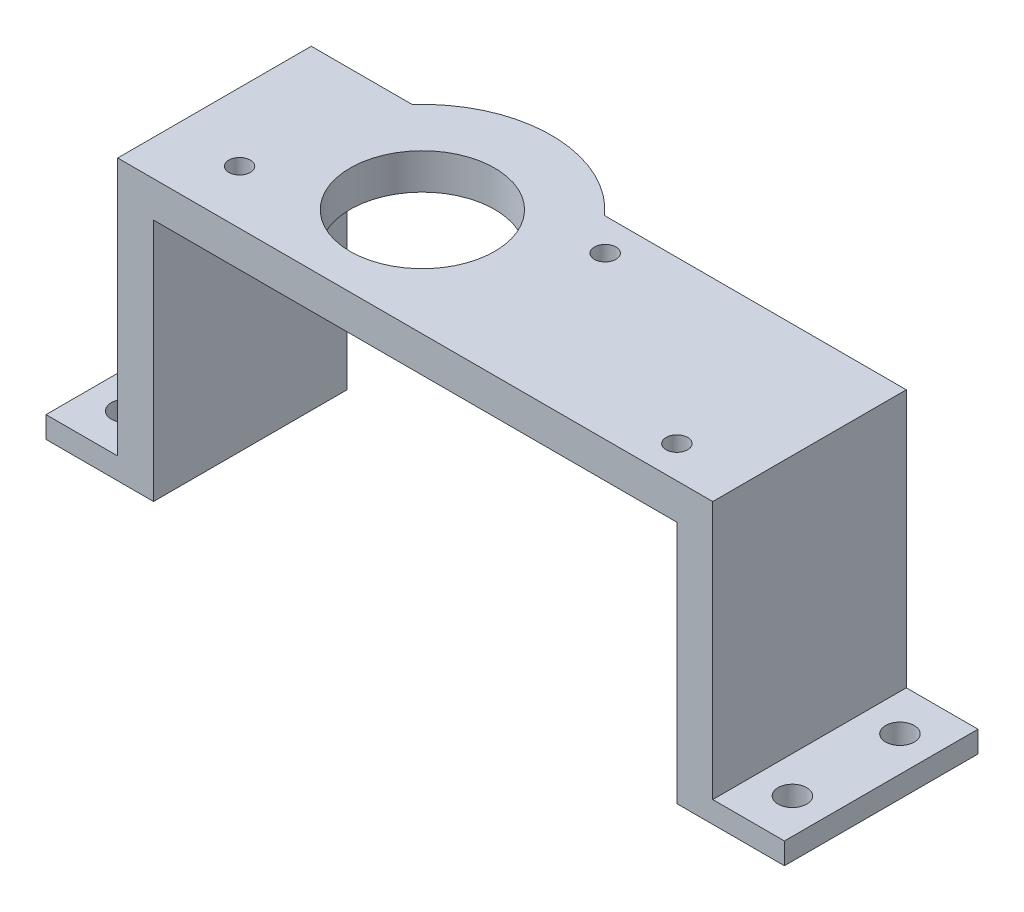
ISO-10303-21;
HEADER;
FILE_DESCRIPTION(('STEP AP214'),'2;1');
FILE_NAME('part.step','',(''),(''),'','','');
FILE_SCHEMA(('AUTOMOTIVE_DESIGN { 1 0 10303 214 1 1 1 1 }'));
ENDSEC;
DATA;
#1=APPLICATION_CONTEXT('core data for automotive mechanical design processes');
#2=APPLICATION_PROTOCOL_DEFINITION('international standard','automotive_design',2000,#1);
#3=PRODUCT_CONTEXT('',#1,'mechanical');
#4=PRODUCT('Part','Part','',(#3));
#5=PRODUCT_RELATED_PRODUCT_CATEGORY('part','',(#4));
#6=PRODUCT_DEFINITION_FORMATION('','',#4);
#7=PRODUCT_DEFINITION_CONTEXT('part definition',#1,'design');
#8=PRODUCT_DEFINITION('design','',#6,#7);
#9=PRODUCT_DEFINITION_SHAPE('','',#8);
#10=(LENGTH_UNIT() NAMED_UNIT(*) SI_UNIT(.MILLI.,.METRE.));
#11=(NAMED_UNIT(*) PLANE_ANGLE_UNIT() SI_UNIT($,.RADIAN.));
#12=(NAMED_UNIT(*) SI_UNIT($,.STERADIAN.) SOLID_ANGLE_UNIT());
#13=UNCERTAINTY_MEASURE_WITH_UNIT(LENGTH_MEASURE(1.E-05),#10,'distance_accuracy_value','');
#14=(GEOMETRIC_REPRESENTATION_CONTEXT(3) GLOBAL_UNCERTAINTY_ASSIGNED_CONTEXT((#13)) GLOBAL_UNIT_ASSIGNED_CONTEXT((#10,
#11,#12)) REPRESENTATION_CONTEXT('',''));
#15=CARTESIAN_POINT('',(0.,0.,0.));
#16=DIRECTION('',(0.,0.,1.));
#17=DIRECTION('',(1.,0.,0.));
#18=AXIS2_PLACEMENT_3D('',#15,#16,#17);
#19=CARTESIAN_POINT('',(-36.3970099667774,-34.,0.));
#20=DIRECTION('',(-1.,0.,0.));
#21=DIRECTION('',(0.,0.,1.));
#22=AXIS2_PLACEMENT_3D('',#19,#20,#21);
#23=PLANE('',#22);
#24=DIRECTION('',(0.,1.,0.));
#25=VECTOR('',#24,1.);
#26=CARTESIAN_POINT('',(-36.3970099667774,-34.,-18.7790697674419));
#27=LINE('',#26,#25);
#28=CARTESIAN_POINT('',(-36.3970099667774,-31.,-18.7790697674419));
#29=VERTEX_POINT('',#28);
#30=CARTESIAN_POINT('',(-36.3970099667774,5.,-18.7790697674419));
#31=VERTEX_POINT('',#30);
#32=EDGE_CURVE('E216',#29,#31,#27,.T.);
#33=ORIENTED_EDGE('',*,*,#32,.F.);
#34=DIRECTION('',(0.,0.,1.));
#35=VECTOR('',#34,1.);
#36=CARTESIAN_POINT('',(-36.3970099667774,-31.,8.22093023255814));
#37=LINE('',#36,#35);
#38=CARTESIAN_POINT('',(-36.3970099667774,-31.,8.22093023255814));
#39=VERTEX_POINT('',#38);
#40=EDGE_CURVE('E412',#29,#39,#37,.T.);
#41=ORIENTED_EDGE('',*,*,#40,.T.);
#42=DIRECTION('',(0.,1.,0.));
#43=VECTOR('',#42,1.);
#44=CARTESIAN_POINT('',(-36.3970099667774,-34.,8.22093023255814));
#45=LINE('',#44,#43);
#46=CARTESIAN_POINT('',(-36.3970099667774,5.,8.22093023255814));
#47=VERTEX_POINT('',#46);
#48=EDGE_CURVE('E227',#39,#47,#45,.T.);
#49=ORIENTED_EDGE('',*,*,#48,.T.);
#50=DIRECTION('',(0.,0.,1.));
#51=VECTOR('',#50,1.);
#52=CARTESIAN_POINT('',(-36.3970099667774,5.,0.));
#53=LINE('',#52,#51);
#54=EDGE_CURVE('E189',#31,#47,#53,.T.);
#55=ORIENTED_EDGE('',*,*,#54,.F.);
#56=EDGE_LOOP('',(#33,#41,#49,#55));
#57=FACE_BOUND('',#56,.T.);
#58=ADVANCED_FACE('F41',(#57),#23,.T.);
#59=CARTESIAN_POINT('',(0.,5.,8.22093023255813));
#60=DIRECTION('',(0.,0.,1.));
#61=DIRECTION('',(1.,0.,0.));
#62=AXIS2_PLACEMENT_3D('',#59,#60,#61);
#63=PLANE('',#62);
#64=DIRECTION('',(-1.,0.,0.));
#65=VECTOR('',#64,1.);
#66=CARTESIAN_POINT('',(0.,0.,8.22093023255813));
#67=LINE('',#66,#65);
#68=CARTESIAN_POINT('',(41.6029900332226,0.,8.22093023255813));
#69=VERTEX_POINT('',#68);
#70=CARTESIAN_POINT('',(-31.3970099667774,0.,8.22093023255814));
#71=VERTEX_POINT('',#70);
#72=EDGE_CURVE('E291',#69,#71,#67,.T.);
#73=ORIENTED_EDGE('',*,*,#72,.F.);
#74=DIRECTION('',(0.,1.,0.));
#75=VECTOR('',#74,1.);
#76=CARTESIAN_POINT('',(41.6029900332226,-34.,8.22093023255813));
#77=LINE('',#76,#75);
#78=CARTESIAN_POINT('',(41.6029900332226,-34.,8.22093023255813));
#79=VERTEX_POINT('',#78);
#80=EDGE_CURVE('E190',#79,#69,#77,.T.);
#81=ORIENTED_EDGE('',*,*,#80,.F.);
#82=DIRECTION('',(1.,0.,0.));
#83=VECTOR('',#82,1.);
#84=CARTESIAN_POINT('',(0.,-34.,8.22093023255814));
#85=LINE('',#84,#83);
#86=CARTESIAN_POINT('',(56.6029900332226,-34.,8.22093023255813));
#87=VERTEX_POINT('',#86);
#88=EDGE_CURVE('E208',#79,#87,#85,.T.);
#89=ORIENTED_EDGE('',*,*,#88,.T.);
#90=DIRECTION('',(0.,-1.,0.));
#91=VECTOR('',#90,1.);
#92=CARTESIAN_POINT('',(56.6029900332226,-31.,8.22093023255813));
#93=LINE('',#92,#91);
#94=CARTESIAN_POINT('',(56.6029900332226,-31.,8.22093023255813));
#95=VERTEX_POINT('',#94);
#96=EDGE_CURVE('E180',#95,#87,#93,.T.);
#97=ORIENTED_EDGE('',*,*,#96,.F.);
#98=DIRECTION('',(-1.,0.,0.));
#99=VECTOR('',#98,1.);
#100=CARTESIAN_POINT('',(56.6029900332226,-31.,8.22093023255813));
#101=LINE('',#100,#99);
#102=CARTESIAN_POINT('',(46.6029900332226,-31.,8.22093023255813));
#103=VERTEX_POINT('',#102);
#104=EDGE_CURVE('E166',#95,#103,#101,.T.);
#105=ORIENTED_EDGE('',*,*,#104,.T.);
#106=DIRECTION('',(0.,1.,0.));
#107=VECTOR('',#106,1.);
#108=CARTESIAN_POINT('',(46.6029900332226,-34.,8.22093023255814));
#109=LINE('',#108,#107);
#110=CARTESIAN_POINT('',(46.6029900332226,5.,8.22093023255814));
#111=VERTEX_POINT('',#110);
#112=EDGE_CURVE('E177',#103,#111,#109,.T.);
#113=ORIENTED_EDGE('',*,*,#112,.T.);
#114=DIRECTION('',(-1.,0.,0.));
#115=VECTOR('',#114,1.);
#116=CARTESIAN_POINT('',(0.,5.,8.22093023255813));
#117=LINE('',#116,#115);
#118=EDGE_CURVE('E247',#111,#47,#117,.T.);
#119=ORIENTED_EDGE('',*,*,#118,.T.);
#120=ORIENTED_EDGE('',*,*,#48,.F.);
#121=DIRECTION('',(-1.,0.,0.));
#122=VECTOR('',#121,1.);
#123=CARTESIAN_POINT('',(-36.3970099667774,-31.,8.22093023255814));
#124=LINE('',#123,#122);
#125=CARTESIAN_POINT('',(-46.3970099667774,-31.,8.22093023255813));
#126=VERTEX_POINT('',#125);
#127=EDGE_CURVE('E67',#39,#126,#124,.T.);
#128=ORIENTED_EDGE('',*,*,#127,.T.);
#129=DIRECTION('',(0.,-1.,0.));
#130=VECTOR('',#129,1.);
#131=CARTESIAN_POINT('',(-46.3970099667774,-31.,8.22093023255813));
#132=LINE('',#131,#130);
#133=CARTESIAN_POINT('',(-46.3970099667774,-34.,8.22093023255813));
#134=VERTEX_POINT('',#133);
#135=EDGE_CURVE('E421',#126,#134,#132,.T.);
#136=ORIENTED_EDGE('',*,*,#135,.T.);
#137=DIRECTION('',(-1.,0.,0.));
#138=VECTOR('',#137,1.);
#139=CARTESIAN_POINT('',(0.,-34.,8.22093023255814));
#140=LINE('',#139,#138);
#141=CARTESIAN_POINT('',(-31.3970099667774,-34.,8.22093023255814));
#142=VERTEX_POINT('',#141);
#143=EDGE_CURVE('E211',#142,#134,#140,.T.);
#144=ORIENTED_EDGE('',*,*,#143,.F.);
#145=DIRECTION('',(0.,1.,0.));
#146=VECTOR('',#145,1.);
#147=CARTESIAN_POINT('',(-31.3970099667774,-34.,8.22093023255814));
#148=LINE('',#147,#146);
#149=EDGE_CURVE('E223',#142,#71,#148,.T.);
#150=ORIENTED_EDGE('',*,*,#149,.T.);
#151=EDGE_LOOP('',(#73,#81,#89,#97,#105,#113,#119,#120,#128,#136,#144,#150));
#152=FACE_BOUND('',#151,.T.);
#153=ADVANCED_FACE('F175',(#152),#63,.T.);
#154=CARTESIAN_POINT('',(0.,5.,-18.7790697674419));
#155=DIRECTION('',(0.,0.,1.));
#156=DIRECTION('',(1.,0.,0.));
#157=AXIS2_PLACEMENT_3D('',#154,#155,#156);
#158=PLANE('',#157);
#159=DIRECTION('',(-1.,0.,0.));
#160=VECTOR('',#159,1.);
#161=CARTESIAN_POINT('',(0.,0.,-18.7790697674419));
#162=LINE('',#161,#160);
#163=CARTESIAN_POINT('',(41.6029900332226,0.,-18.7790697674419));
#164=VERTEX_POINT('',#163);
#165=CARTESIAN_POINT('',(4.51939789822134,0.,-18.7790697674419));
#166=VERTEX_POINT('',#165);
#167=EDGE_CURVE('E298',#164,#166,#162,.T.);
#168=ORIENTED_EDGE('',*,*,#167,.T.);
#169=DIRECTION('',(0.,-1.,0.));
#170=VECTOR('',#169,1.);
#171=CARTESIAN_POINT('',(4.51939789822134,5.,-18.7790697674419));
#172=LINE('',#171,#170);
#173=CARTESIAN_POINT('',(4.51939789822134,5.,-18.7790697674419));
#174=VERTEX_POINT('',#173);
#175=EDGE_CURVE('E11',#174,#166,#172,.T.);
#176=ORIENTED_EDGE('',*,*,#175,.F.);
#177=DIRECTION('',(-1.,0.,0.));
#178=VECTOR('',#177,1.);
#179=CARTESIAN_POINT('',(0.,5.,-18.7790697674419));
#180=LINE('',#179,#178);
#181=CARTESIAN_POINT('',(46.6029900332226,5.,-18.7790697674419));
#182=VERTEX_POINT('',#181);
#183=EDGE_CURVE('E250',#182,#174,#180,.T.);
#184=ORIENTED_EDGE('',*,*,#183,.F.);
#185=DIRECTION('',(0.,1.,0.));
#186=VECTOR('',#185,1.);
#187=CARTESIAN_POINT('',(46.6029900332226,-34.,-18.7790697674419));
#188=LINE('',#187,#186);
#189=CARTESIAN_POINT('',(46.6029900332226,-31.,-18.7790697674419));
#190=VERTEX_POINT('',#189);
#191=EDGE_CURVE('E205',#190,#182,#188,.T.);
#192=ORIENTED_EDGE('',*,*,#191,.F.);
#193=DIRECTION('',(1.,0.,0.));
#194=VECTOR('',#193,1.);
#195=CARTESIAN_POINT('',(56.6029900332226,-31.,-18.7790697674419));
#196=LINE('',#195,#194);
#197=CARTESIAN_POINT('',(56.6029900332226,-31.,-18.7790697674419));
#198=VERTEX_POINT('',#197);
#199=EDGE_CURVE('E59',#190,#198,#196,.T.);
#200=ORIENTED_EDGE('',*,*,#199,.T.);
#201=DIRECTION('',(0.,-1.,0.));
#202=VECTOR('',#201,1.);
#203=CARTESIAN_POINT('',(56.6029900332226,-31.,-18.7790697674419));
#204=LINE('',#203,#202);
#205=CARTESIAN_POINT('',(56.6029900332226,-34.,-18.7790697674419));
#206=VERTEX_POINT('',#205);
#207=EDGE_CURVE('E447',#198,#206,#204,.T.);
#208=ORIENTED_EDGE('',*,*,#207,.T.);
#209=DIRECTION('',(1.,0.,0.));
#210=VECTOR('',#209,1.);
#211=CARTESIAN_POINT('',(0.,-34.,-18.7790697674419));
#212=LINE('',#211,#210);
#213=CARTESIAN_POINT('',(41.6029900332226,-34.,-18.7790697674419));
#214=VERTEX_POINT('',#213);
#215=EDGE_CURVE('E414',#214,#206,#212,.T.);
#216=ORIENTED_EDGE('',*,*,#215,.F.);
#217=DIRECTION('',(0.,1.,0.));
#218=VECTOR('',#217,1.);
#219=CARTESIAN_POINT('',(41.6029900332226,-34.,-18.7790697674419));
#220=LINE('',#219,#218);
#221=EDGE_CURVE('E197',#214,#164,#220,.T.);
#222=ORIENTED_EDGE('',*,*,#221,.T.);
#223=EDGE_LOOP('',(#168,#176,#184,#192,#200,#208,#216,#222));
#224=FACE_BOUND('',#223,.T.);
#225=ADVANCED_FACE('F362',(#224),#158,.F.);
#226=CARTESIAN_POINT('',(-8.89700996677741,5.,-6.77906976744187));
#227=DIRECTION('',(0.,-1.,0.));
#228=DIRECTION('',(0.,0.,-1.));
#229=AXIS2_PLACEMENT_3D('',#226,#227,#228);
#230=CYLINDRICAL_SURFACE('',#229,18.);
#231=CARTESIAN_POINT('',(-8.89700996677741,0.,-6.77906976744187));
#232=DIRECTION('',(0.,1.,0.));
#233=DIRECTION('',(0.,0.,1.));
#234=AXIS2_PLACEMENT_3D('',#231,#232,#233);
#235=CIRCLE('',#234,18.);
#236=CARTESIAN_POINT('',(-22.3134178317762,0.,-18.7790697674419));
#237=VERTEX_POINT('',#236);
#238=EDGE_CURVE('E301',#166,#237,#235,.T.);
#239=ORIENTED_EDGE('',*,*,#238,.T.);
#240=DIRECTION('',(0.,-1.,0.));
#241=VECTOR('',#240,1.);
#242=CARTESIAN_POINT('',(-22.3134178317762,5.,-18.7790697674419));
#243=LINE('',#242,#241);
#244=CARTESIAN_POINT('',(-22.3134178317762,5.,-18.7790697674419));
#245=VERTEX_POINT('',#244);
#246=EDGE_CURVE('E51',#245,#237,#243,.T.);
#247=ORIENTED_EDGE('',*,*,#246,.F.);
#248=CARTESIAN_POINT('',(-8.89700996677741,5.,-6.77906976744187));
#249=DIRECTION('',(0.,1.,0.));
#250=DIRECTION('',(0.,0.,1.));
#251=AXIS2_PLACEMENT_3D('',#248,#249,#250);
#252=CIRCLE('',#251,18.);
#253=EDGE_CURVE('E253',#174,#245,#252,.T.);
#254=ORIENTED_EDGE('',*,*,#253,.F.);
#255=ORIENTED_EDGE('',*,*,#175,.T.);
#256=EDGE_LOOP('',(#239,#247,#254,#255));
#257=FACE_BOUND('',#256,.T.);
#258=ADVANCED_FACE('F385',(#257),#230,.T.);
#259=CARTESIAN_POINT('',(0.,5.,3.72093023255813));
#260=DIRECTION('',(0.,0.,-1.));
#261=DIRECTION('',(-1.,0.,0.));
#262=AXIS2_PLACEMENT_3D('',#259,#260,#261);
#263=PLANE('',#262);
#264=DIRECTION('',(1.,0.,0.));
#265=VECTOR('',#264,1.);
#266=CARTESIAN_POINT('',(0.,0.,3.72093023255813));
#267=LINE('',#266,#265);
#268=CARTESIAN_POINT('',(-23.5429080005277,0.,3.72093023255813));
#269=VERTEX_POINT('',#268);
#270=CARTESIAN_POINT('',(-23.5172014839909,0.,3.72093023255813));
#271=VERTEX_POINT('',#270);
#272=EDGE_CURVE('E222',#269,#271,#267,.T.);
#273=ORIENTED_EDGE('',*,*,#272,.F.);
#274=DIRECTION('',(0.,-1.,0.));
#275=VECTOR('',#274,1.);
#276=CARTESIAN_POINT('',(-23.5429080005277,5.,3.72093023255813));
#277=LINE('',#276,#275);
#278=CARTESIAN_POINT('',(-23.5429080005277,5.,3.72093023255813));
#279=VERTEX_POINT('',#278);
#280=EDGE_CURVE('E45',#279,#269,#277,.T.);
#281=ORIENTED_EDGE('',*,*,#280,.F.);
#282=DIRECTION('',(1.,0.,0.));
#283=VECTOR('',#282,1.);
#284=CARTESIAN_POINT('',(0.,5.,3.72093023255813));
#285=LINE('',#284,#283);
#286=CARTESIAN_POINT('',(-23.5172014839909,5.,3.72093023255813));
#287=VERTEX_POINT('',#286);
#288=EDGE_CURVE('E232',#279,#287,#285,.T.);
#289=ORIENTED_EDGE('',*,*,#288,.T.);
#290=DIRECTION('',(0.,-1.,0.));
#291=VECTOR('',#290,1.);
#292=CARTESIAN_POINT('',(-23.5172014839909,5.,3.72093023255813));
#293=LINE('',#292,#291);
#294=EDGE_CURVE('E272',#287,#271,#293,.T.);
#295=ORIENTED_EDGE('',*,*,#294,.T.);
#296=EDGE_LOOP('',(#273,#281,#289,#295));
#297=FACE_BOUND('',#296,.T.);
#298=ADVANCED_FACE('F43',(#297),#263,.T.);
#299=CARTESIAN_POINT('',(-26.8970099667774,5.,0.72093023255813));
#300=DIRECTION('',(0.,-1.,0.));
#301=DIRECTION('',(0.,0.,-1.));
#302=AXIS2_PLACEMENT_3D('',#299,#300,#301);
#303=CYLINDRICAL_SURFACE('',#302,4.5);
#304=CARTESIAN_POINT('',(-26.8970099667774,0.,0.72093023255813));
#305=DIRECTION('',(0.,1.,0.));
#306=DIRECTION('',(0.,0.,1.));
#307=AXIS2_PLACEMENT_3D('',#304,#305,#306);
#308=CIRCLE('',#307,4.5);
#309=CARTESIAN_POINT('',(-23.5286730932759,0.,3.70493872896187));
#310=VERTEX_POINT('',#309);
#311=EDGE_CURVE('E276',#269,#310,#308,.T.);
#312=ORIENTED_EDGE('',*,*,#311,.T.);
#313=DIRECTION('',(0.,-1.,0.));
#314=VECTOR('',#313,1.);
#315=CARTESIAN_POINT('',(-23.5286730932759,5.,3.70493872896187));
#316=LINE('',#315,#314);
#317=CARTESIAN_POINT('',(-23.5286730932759,5.,3.70493872896187));
#318=VERTEX_POINT('',#317);
#319=EDGE_CURVE('E322',#318,#310,#316,.T.);
#320=ORIENTED_EDGE('',*,*,#319,.F.);
#321=CARTESIAN_POINT('',(-26.8970099667774,5.,0.72093023255813));
#322=DIRECTION('',(0.,1.,0.));
#323=DIRECTION('',(0.,0.,1.));
#324=AXIS2_PLACEMENT_3D('',#321,#322,#323);
#325=CIRCLE('',#324,4.5);
#326=EDGE_CURVE('E236',#279,#318,#325,.T.);
#327=ORIENTED_EDGE('',*,*,#326,.F.);
#328=ORIENTED_EDGE('',*,*,#280,.T.);
#329=EDGE_LOOP('',(#312,#320,#327,#328));
#330=FACE_BOUND('',#329,.T.);
#331=ADVANCED_FACE('F333',(#330),#303,.T.);
#332=CARTESIAN_POINT('',(9.10299003322259,5.,-14.2790697674419));
#333=DIRECTION('',(0.,-1.,0.));
#334=DIRECTION('',(0.,0.,-1.));
#335=AXIS2_PLACEMENT_3D('',#332,#333,#334);
#336=CYLINDRICAL_SURFACE('',#335,1.5);
#337=CARTESIAN_POINT('',(9.10299003322259,5.,-14.2790697674419));
#338=DIRECTION('',(0.,1.,0.));
#339=DIRECTION('',(0.,0.,1.));
#340=AXIS2_PLACEMENT_3D('',#337,#338,#339);
#341=CIRCLE('',#340,1.5);
#342=CARTESIAN_POINT('',(9.10299003322259,5.,-12.7790697674419));
#343=VERTEX_POINT('',#342);
#344=EDGE_CURVE('E264',#343,#343,#341,.T.);
#345=ORIENTED_EDGE('',*,*,#344,.T.);
#346=EDGE_LOOP('',(#345));
#347=FACE_BOUND('',#346,.T.);
#348=CARTESIAN_POINT('',(9.10299003322259,0.,-14.2790697674419));
#349=DIRECTION('',(0.,1.,0.));
#350=DIRECTION('',(0.,0.,1.));
#351=AXIS2_PLACEMENT_3D('',#348,#349,#350);
#352=CIRCLE('',#351,1.5);
#353=CARTESIAN_POINT('',(9.10299003322259,0.,-12.7790697674419));
#354=VERTEX_POINT('',#353);
#355=EDGE_CURVE('E311',#354,#354,#352,.T.);
#356=ORIENTED_EDGE('',*,*,#355,.F.);
#357=EDGE_LOOP('',(#356));
#358=FACE_BOUND('',#357,.T.);
#359=ADVANCED_FACE('F374',(#347,#358),#336,.F.);
#360=CARTESIAN_POINT('',(-8.89700996677741,5.,-6.77906976744187));
#361=DIRECTION('',(0.,-1.,0.));
#362=DIRECTION('',(0.,0.,-1.));
#363=AXIS2_PLACEMENT_3D('',#360,#361,#362);
#364=CYLINDRICAL_SURFACE('',#363,10.0794189178143);
#365=CARTESIAN_POINT('',(-8.89700996677741,5.,-6.77906976744187));
#366=DIRECTION('',(0.,1.,0.));
#367=DIRECTION('',(0.,0.,1.));
#368=AXIS2_PLACEMENT_3D('',#365,#366,#367);
#369=CIRCLE('',#368,10.0794189178143);
#370=CARTESIAN_POINT('',(-8.89700996677741,5.,3.30034915037244));
#371=VERTEX_POINT('',#370);
#372=EDGE_CURVE('E260',#371,#371,#369,.T.);
#373=ORIENTED_EDGE('',*,*,#372,.T.);
#374=EDGE_LOOP('',(#373));
#375=FACE_BOUND('',#374,.T.);
#376=CARTESIAN_POINT('',(-8.89700996677741,0.,-6.77906976744187));
#377=DIRECTION('',(0.,1.,0.));
#378=DIRECTION('',(0.,0.,1.));
#379=AXIS2_PLACEMENT_3D('',#376,#377,#378);
#380=CIRCLE('',#379,10.0794189178143);
#381=CARTESIAN_POINT('',(-8.89700996677741,0.,3.30034915037244));
#382=VERTEX_POINT('',#381);
#383=EDGE_CURVE('E307',#382,#382,#380,.T.);
#384=ORIENTED_EDGE('',*,*,#383,.F.);
#385=EDGE_LOOP('',(#384));
#386=FACE_BOUND('',#385,.T.);
#387=ADVANCED_FACE('F377',(#375,#386),#364,.F.);
#388=CARTESIAN_POINT('',(0.,5.,-18.7790697674419));
#389=DIRECTION('',(0.,0.,1.));
#390=DIRECTION('',(1.,0.,0.));
#391=AXIS2_PLACEMENT_3D('',#388,#389,#390);
#392=PLANE('',#391);
#393=DIRECTION('',(-1.,0.,0.));
#394=VECTOR('',#393,1.);
#395=CARTESIAN_POINT('',(0.,0.,-18.7790697674419));
#396=LINE('',#395,#394);
#397=CARTESIAN_POINT('',(-31.3970099667774,0.,-18.7790697674419));
#398=VERTEX_POINT('',#397);
#399=EDGE_CURVE('E304',#237,#398,#396,.T.);
#400=ORIENTED_EDGE('',*,*,#399,.T.);
#401=DIRECTION('',(0.,1.,0.));
#402=VECTOR('',#401,1.);
#403=CARTESIAN_POINT('',(-31.3970099667774,-34.,-18.7790697674419));
#404=LINE('',#403,#402);
#405=CARTESIAN_POINT('',(-31.3970099667774,-34.,-18.7790697674419));
#406=VERTEX_POINT('',#405);
#407=EDGE_CURVE('E218',#406,#398,#404,.T.);
#408=ORIENTED_EDGE('',*,*,#407,.F.);
#409=DIRECTION('',(-1.,0.,0.));
#410=VECTOR('',#409,1.);
#411=CARTESIAN_POINT('',(0.,-34.,-18.7790697674419));
#412=LINE('',#411,#410);
#413=CARTESIAN_POINT('',(-46.3970099667774,-34.,-18.7790697674419));
#414=VERTEX_POINT('',#413);
#415=EDGE_CURVE('E195',#406,#414,#412,.T.);
#416=ORIENTED_EDGE('',*,*,#415,.T.);
#417=DIRECTION('',(0.,-1.,0.));
#418=VECTOR('',#417,1.);
#419=CARTESIAN_POINT('',(-46.3970099667774,-31.,-18.7790697674419));
#420=LINE('',#419,#418);
#421=CARTESIAN_POINT('',(-46.3970099667774,-31.,-18.7790697674419));
#422=VERTEX_POINT('',#421);
#423=EDGE_CURVE('E415',#422,#414,#420,.T.);
#424=ORIENTED_EDGE('',*,*,#423,.F.);
#425=DIRECTION('',(1.,0.,0.));
#426=VECTOR('',#425,1.);
#427=CARTESIAN_POINT('',(-36.3970099667774,-31.,-18.7790697674419));
#428=LINE('',#427,#426);
#429=EDGE_CURVE('E429',#422,#29,#428,.T.);
#430=ORIENTED_EDGE('',*,*,#429,.T.);
#431=ORIENTED_EDGE('',*,*,#32,.T.);
#432=DIRECTION('',(-1.,0.,0.));
#433=VECTOR('',#432,1.);
#434=CARTESIAN_POINT('',(0.,5.,-18.7790697674419));
#435=LINE('',#434,#433);
#436=EDGE_CURVE('E256',#245,#31,#435,.T.);
#437=ORIENTED_EDGE('',*,*,#436,.F.);
#438=ORIENTED_EDGE('',*,*,#246,.T.);
#439=EDGE_LOOP('',(#400,#408,#416,#424,#430,#431,#437,#438));
#440=FACE_BOUND('',#439,.T.);
#441=ADVANCED_FACE('F353',(#440),#392,.F.);
#442=CARTESIAN_POINT('',(-26.8970099667774,5.,0.72093023255813));
#443=DIRECTION('',(0.,-1.,0.));
#444=DIRECTION('',(0.,0.,-1.));
#445=AXIS2_PLACEMENT_3D('',#442,#443,#444);
#446=CYLINDRICAL_SURFACE('',#445,1.5);
#447=CARTESIAN_POINT('',(-26.8970099667774,5.,0.72093023255813));
#448=DIRECTION('',(0.,1.,0.));
#449=DIRECTION('',(0.,0.,1.));
#450=AXIS2_PLACEMENT_3D('',#447,#448,#449);
#451=CIRCLE('',#450,1.5);
#452=CARTESIAN_POINT('',(-26.8970099667774,5.,2.22093023255813));
#453=VERTEX_POINT('',#452);
#454=EDGE_CURVE('E243',#453,#453,#451,.T.);
#455=ORIENTED_EDGE('',*,*,#454,.T.);
#456=EDGE_LOOP('',(#455));
#457=FACE_BOUND('',#456,.T.);
#458=CARTESIAN_POINT('',(-26.8970099667774,0.,0.72093023255813));
#459=DIRECTION('',(0.,1.,0.));
#460=DIRECTION('',(0.,0.,1.));
#461=AXIS2_PLACEMENT_3D('',#458,#459,#460);
#462=CIRCLE('',#461,1.5);
#463=CARTESIAN_POINT('',(-26.8970099667774,0.,2.22093023255813));
#464=VERTEX_POINT('',#463);
#465=EDGE_CURVE('E283',#464,#464,#462,.T.);
#466=ORIENTED_EDGE('',*,*,#465,.F.);
#467=EDGE_LOOP('',(#466));
#468=FACE_BOUND('',#467,.T.);
#469=ADVANCED_FACE('F344',(#457,#468),#446,.F.);
#470=CARTESIAN_POINT('',(-8.89700996677741,5.,-6.77906976744187));
#471=DIRECTION('',(0.,-1.,0.));
#472=DIRECTION('',(0.,0.,-1.));
#473=AXIS2_PLACEMENT_3D('',#470,#471,#472);
#474=CYLINDRICAL_SURFACE('',#473,18.);
#475=CARTESIAN_POINT('',(-8.89700996677741,0.,-6.77906976744187));
#476=DIRECTION('',(0.,1.,0.));
#477=DIRECTION('',(0.,0.,1.));
#478=AXIS2_PLACEMENT_3D('',#475,#476,#477);
#479=CIRCLE('',#478,18.);
#480=EDGE_CURVE('E279',#310,#271,#479,.T.);
#481=ORIENTED_EDGE('',*,*,#480,.T.);
#482=ORIENTED_EDGE('',*,*,#294,.F.);
#483=CARTESIAN_POINT('',(-8.89700996677741,5.,-6.77906976744187));
#484=DIRECTION('',(0.,1.,0.));
#485=DIRECTION('',(0.,0.,1.));
#486=AXIS2_PLACEMENT_3D('',#483,#484,#485);
#487=CIRCLE('',#486,18.);
#488=EDGE_CURVE('E240',#318,#287,#487,.T.);
#489=ORIENTED_EDGE('',*,*,#488,.F.);
#490=ORIENTED_EDGE('',*,*,#319,.T.);
#491=EDGE_LOOP('',(#481,#482,#489,#490));
#492=FACE_BOUND('',#491,.T.);
#493=ADVANCED_FACE('F341',(#492),#474,.T.);
#494=CARTESIAN_POINT('',(37.1029900332226,5.,3.72093023255813));
#495=DIRECTION('',(0.,-1.,0.));
#496=DIRECTION('',(0.,0.,-1.));
#497=AXIS2_PLACEMENT_3D('',#494,#495,#496);
#498=CYLINDRICAL_SURFACE('',#497,1.5);
#499=CARTESIAN_POINT('',(37.1029900332226,5.,3.72093023255813));
#500=DIRECTION('',(0.,1.,0.));
#501=DIRECTION('',(0.,0.,1.));
#502=AXIS2_PLACEMENT_3D('',#499,#500,#501);
#503=CIRCLE('',#502,1.5);
#504=CARTESIAN_POINT('',(37.1029900332226,5.,5.22093023255813));
#505=VERTEX_POINT('',#504);
#506=EDGE_CURVE('E268',#505,#505,#503,.T.);
#507=ORIENTED_EDGE('',*,*,#506,.T.);
#508=EDGE_LOOP('',(#507));
#509=FACE_BOUND('',#508,.T.);
#510=CARTESIAN_POINT('',(37.1029900332226,0.,3.72093023255813));
#511=DIRECTION('',(0.,1.,0.));
#512=DIRECTION('',(0.,0.,1.));
#513=AXIS2_PLACEMENT_3D('',#510,#511,#512);
#514=CIRCLE('',#513,1.5);
#515=CARTESIAN_POINT('',(37.1029900332226,0.,5.22093023255813));
#516=VERTEX_POINT('',#515);
#517=EDGE_CURVE('E237',#516,#516,#514,.T.);
#518=ORIENTED_EDGE('',*,*,#517,.F.);
#519=EDGE_LOOP('',(#518));
#520=FACE_BOUND('',#519,.T.);
#521=ADVANCED_FACE('F343',(#509,#520),#498,.F.);
#522=CARTESIAN_POINT('',(0.,5.,0.));
#523=DIRECTION('',(0.,1.,0.));
#524=DIRECTION('',(0.,0.,1.));
#525=AXIS2_PLACEMENT_3D('',#522,#523,#524);
#526=PLANE('',#525);
#527=ORIENTED_EDGE('',*,*,#288,.F.);
#528=ORIENTED_EDGE('',*,*,#326,.T.);
#529=ORIENTED_EDGE('',*,*,#488,.T.);
#530=EDGE_LOOP('',(#527,#528,#529));
#531=FACE_BOUND('',#530,.T.);
#532=ORIENTED_EDGE('',*,*,#454,.F.);
#533=EDGE_LOOP('',(#532));
#534=FACE_BOUND('',#533,.T.);
#535=ORIENTED_EDGE('',*,*,#436,.T.);
#536=ORIENTED_EDGE('',*,*,#54,.T.);
#537=ORIENTED_EDGE('',*,*,#118,.F.);
#538=DIRECTION('',(0.,0.,1.));
#539=VECTOR('',#538,1.);
#540=CARTESIAN_POINT('',(46.6029900332226,5.,0.));
#541=LINE('',#540,#539);
#542=EDGE_CURVE('E187',#182,#111,#541,.T.);
#543=ORIENTED_EDGE('',*,*,#542,.F.);
#544=ORIENTED_EDGE('',*,*,#183,.T.);
#545=ORIENTED_EDGE('',*,*,#253,.T.);
#546=EDGE_LOOP('',(#535,#536,#537,#543,#544,#545));
#547=FACE_BOUND('',#546,.T.);
#548=ORIENTED_EDGE('',*,*,#372,.F.);
#549=EDGE_LOOP('',(#548));
#550=FACE_BOUND('',#549,.T.);
#551=ORIENTED_EDGE('',*,*,#344,.F.);
#552=EDGE_LOOP('',(#551));
#553=FACE_BOUND('',#552,.T.);
#554=ORIENTED_EDGE('',*,*,#506,.F.);
#555=EDGE_LOOP('',(#554));
#556=FACE_BOUND('',#555,.T.);
#557=ADVANCED_FACE('F350',(#531,#534,#547,#550,#553,#556),#526,.T.);
#558=CARTESIAN_POINT('',(0.,0.,0.));
#559=DIRECTION('',(0.,1.,0.));
#560=DIRECTION('',(0.,0.,1.));
#561=AXIS2_PLACEMENT_3D('',#558,#559,#560);
#562=PLANE('',#561);
#563=ORIENTED_EDGE('',*,*,#272,.T.);
#564=ORIENTED_EDGE('',*,*,#480,.F.);
#565=ORIENTED_EDGE('',*,*,#311,.F.);
#566=EDGE_LOOP('',(#563,#564,#565));
#567=FACE_BOUND('',#566,.T.);
#568=ORIENTED_EDGE('',*,*,#465,.T.);
#569=EDGE_LOOP('',(#568));
#570=FACE_BOUND('',#569,.T.);
#571=DIRECTION('',(0.,0.,1.));
#572=VECTOR('',#571,1.);
#573=CARTESIAN_POINT('',(-31.3970099667774,0.,0.));
#574=LINE('',#573,#572);
#575=EDGE_CURVE('E287',#398,#71,#574,.T.);
#576=ORIENTED_EDGE('',*,*,#575,.F.);
#577=ORIENTED_EDGE('',*,*,#399,.F.);
#578=ORIENTED_EDGE('',*,*,#238,.F.);
#579=ORIENTED_EDGE('',*,*,#167,.F.);
#580=DIRECTION('',(0.,0.,1.));
#581=VECTOR('',#580,1.);
#582=CARTESIAN_POINT('',(41.6029900332226,0.,0.));
#583=LINE('',#582,#581);
#584=EDGE_CURVE('E294',#164,#69,#583,.T.);
#585=ORIENTED_EDGE('',*,*,#584,.T.);
#586=ORIENTED_EDGE('',*,*,#72,.T.);
#587=EDGE_LOOP('',(#576,#577,#578,#579,#585,#586));
#588=FACE_BOUND('',#587,.T.);
#589=ORIENTED_EDGE('',*,*,#383,.T.);
#590=EDGE_LOOP('',(#589));
#591=FACE_BOUND('',#590,.T.);
#592=ORIENTED_EDGE('',*,*,#355,.T.);
#593=EDGE_LOOP('',(#592));
#594=FACE_BOUND('',#593,.T.);
#595=ORIENTED_EDGE('',*,*,#517,.T.);
#596=EDGE_LOOP('',(#595));
#597=FACE_BOUND('',#596,.T.);
#598=ADVANCED_FACE('F338',(#567,#570,#588,#591,#594,#597),#562,.F.);
#599=CARTESIAN_POINT('',(-31.3970099667774,-34.,0.));
#600=DIRECTION('',(-1.,0.,0.));
#601=DIRECTION('',(0.,0.,1.));
#602=AXIS2_PLACEMENT_3D('',#599,#600,#601);
#603=PLANE('',#602);
#604=ORIENTED_EDGE('',*,*,#407,.T.);
#605=ORIENTED_EDGE('',*,*,#575,.T.);
#606=ORIENTED_EDGE('',*,*,#149,.F.);
#607=DIRECTION('',(0.,0.,1.));
#608=VECTOR('',#607,1.);
#609=CARTESIAN_POINT('',(-31.3970099667774,-34.,0.));
#610=LINE('',#609,#608);
#611=EDGE_CURVE('E214',#406,#142,#610,.T.);
#612=ORIENTED_EDGE('',*,*,#611,.F.);
#613=EDGE_LOOP('',(#604,#605,#606,#612));
#614=FACE_BOUND('',#613,.T.);
#615=ADVANCED_FACE('F367',(#614),#603,.F.);
#616=CARTESIAN_POINT('',(0.,-34.,0.));
#617=DIRECTION('',(0.,1.,0.));
#618=DIRECTION('',(0.,0.,1.));
#619=AXIS2_PLACEMENT_3D('',#616,#617,#618);
#620=PLANE('',#619);
#621=ORIENTED_EDGE('',*,*,#415,.F.);
#622=ORIENTED_EDGE('',*,*,#611,.T.);
#623=ORIENTED_EDGE('',*,*,#143,.T.);
#624=DIRECTION('',(0.,0.,-1.));
#625=VECTOR('',#624,1.);
#626=CARTESIAN_POINT('',(-46.3970099667774,-34.,8.22093023255813));
#627=LINE('',#626,#625);
#628=EDGE_CURVE('E432',#134,#414,#627,.T.);
#629=ORIENTED_EDGE('',*,*,#628,.T.);
#630=EDGE_LOOP('',(#621,#622,#623,#629));
#631=FACE_BOUND('',#630,.T.);
#632=CARTESIAN_POINT('',(-41.2846277822866,-34.,-12.7790697674419));
#633=DIRECTION('',(0.,-1.,0.));
#634=DIRECTION('',(0.,0.,-1.));
#635=AXIS2_PLACEMENT_3D('',#632,#633,#634);
#636=CIRCLE('',#635,2.);
#637=CARTESIAN_POINT('',(-41.2846277822866,-34.,-14.7790697674419));
#638=VERTEX_POINT('',#637);
#639=EDGE_CURVE('E446',#638,#638,#636,.T.);
#640=ORIENTED_EDGE('',*,*,#639,.F.);
#641=EDGE_LOOP('',(#640));
#642=FACE_BOUND('',#641,.T.);
#643=CARTESIAN_POINT('',(-41.2846277822866,-34.,2.22093023255814));
#644=DIRECTION('',(0.,-1.,0.));
#645=DIRECTION('',(0.,0.,-1.));
#646=AXIS2_PLACEMENT_3D('',#643,#644,#645);
#647=CIRCLE('',#646,2.);
#648=CARTESIAN_POINT('',(-41.2846277822866,-34.,0.220930232558133));
#649=VERTEX_POINT('',#648);
#650=EDGE_CURVE('E468',#649,#649,#647,.T.);
#651=ORIENTED_EDGE('',*,*,#650,.F.);
#652=EDGE_LOOP('',(#651));
#653=FACE_BOUND('',#652,.T.);
#654=ADVANCED_FACE('F550',(#631,#642,#653),#620,.F.);
#655=CARTESIAN_POINT('',(46.6029900332226,-34.,0.));
#656=DIRECTION('',(-1.,0.,0.));
#657=DIRECTION('',(0.,0.,1.));
#658=AXIS2_PLACEMENT_3D('',#655,#656,#657);
#659=PLANE('',#658);
#660=ORIENTED_EDGE('',*,*,#112,.F.);
#661=DIRECTION('',(0.,0.,-1.));
#662=VECTOR('',#661,1.);
#663=CARTESIAN_POINT('',(46.6029900332226,-31.,8.22093023255813));
#664=LINE('',#663,#662);
#665=EDGE_CURVE('E163',#103,#190,#664,.T.);
#666=ORIENTED_EDGE('',*,*,#665,.T.);
#667=ORIENTED_EDGE('',*,*,#191,.T.);
#668=ORIENTED_EDGE('',*,*,#542,.T.);
#669=EDGE_LOOP('',(#660,#666,#667,#668));
#670=FACE_BOUND('',#669,.T.);
#671=ADVANCED_FACE('F185',(#670),#659,.F.);
#672=CARTESIAN_POINT('',(41.6029900332226,-34.,0.));
#673=DIRECTION('',(1.,0.,0.));
#674=DIRECTION('',(0.,0.,-1.));
#675=AXIS2_PLACEMENT_3D('',#672,#673,#674);
#676=PLANE('',#675);
#677=ORIENTED_EDGE('',*,*,#584,.F.);
#678=ORIENTED_EDGE('',*,*,#221,.F.);
#679=DIRECTION('',(0.,0.,-1.));
#680=VECTOR('',#679,1.);
#681=CARTESIAN_POINT('',(41.6029900332226,-34.,0.));
#682=LINE('',#681,#680);
#683=EDGE_CURVE('E418',#79,#214,#682,.T.);
#684=ORIENTED_EDGE('',*,*,#683,.F.);
#685=ORIENTED_EDGE('',*,*,#80,.T.);
#686=EDGE_LOOP('',(#677,#678,#684,#685));
#687=FACE_BOUND('',#686,.T.);
#688=ADVANCED_FACE('F518',(#687),#676,.F.);
#689=CARTESIAN_POINT('',(0.,-34.,0.));
#690=DIRECTION('',(0.,1.,0.));
#691=DIRECTION('',(0.,0.,1.));
#692=AXIS2_PLACEMENT_3D('',#689,#690,#691);
#693=PLANE('',#692);
#694=ORIENTED_EDGE('',*,*,#215,.T.);
#695=DIRECTION('',(0.,0.,1.));
#696=VECTOR('',#695,1.);
#697=CARTESIAN_POINT('',(56.6029900332226,-34.,8.22093023255813));
#698=LINE('',#697,#696);
#699=EDGE_CURVE('E182',#206,#87,#698,.T.);
#700=ORIENTED_EDGE('',*,*,#699,.T.);
#701=ORIENTED_EDGE('',*,*,#88,.F.);
#702=ORIENTED_EDGE('',*,*,#683,.T.);
#703=EDGE_LOOP('',(#694,#700,#701,#702));
#704=FACE_BOUND('',#703,.T.);
#705=CARTESIAN_POINT('',(51.7153722177134,-34.,-12.7790697674419));
#706=DIRECTION('',(0.,-1.,0.));
#707=DIRECTION('',(0.,0.,-1.));
#708=AXIS2_PLACEMENT_3D('',#705,#706,#707);
#709=CIRCLE('',#708,2.);
#710=CARTESIAN_POINT('',(51.7153722177134,-34.,-14.7790697674419));
#711=VERTEX_POINT('',#710);
#712=EDGE_CURVE('E500',#711,#711,#709,.T.);
#713=ORIENTED_EDGE('',*,*,#712,.F.);
#714=EDGE_LOOP('',(#713));
#715=FACE_BOUND('',#714,.T.);
#716=CARTESIAN_POINT('',(51.7153722177134,-34.,2.22093023255813));
#717=DIRECTION('',(0.,-1.,0.));
#718=DIRECTION('',(0.,0.,-1.));
#719=AXIS2_PLACEMENT_3D('',#716,#717,#718);
#720=CIRCLE('',#719,2.);
#721=CARTESIAN_POINT('',(51.7153722177134,-34.,0.220930232558126));
#722=VERTEX_POINT('',#721);
#723=EDGE_CURVE('E457',#722,#722,#720,.T.);
#724=ORIENTED_EDGE('',*,*,#723,.F.);
#725=EDGE_LOOP('',(#724));
#726=FACE_BOUND('',#725,.T.);
#727=ADVANCED_FACE('F449',(#704,#715,#726),#693,.F.);
#728=CARTESIAN_POINT('',(-46.3970099667774,-31.,8.22093023255813));
#729=DIRECTION('',(-1.,0.,0.));
#730=DIRECTION('',(0.,0.,1.));
#731=AXIS2_PLACEMENT_3D('',#728,#729,#730);
#732=PLANE('',#731);
#733=ORIENTED_EDGE('',*,*,#628,.F.);
#734=ORIENTED_EDGE('',*,*,#135,.F.);
#735=DIRECTION('',(0.,0.,-1.));
#736=VECTOR('',#735,1.);
#737=CARTESIAN_POINT('',(-46.3970099667774,-31.,8.22093023255813));
#738=LINE('',#737,#736);
#739=EDGE_CURVE('E483',#126,#422,#738,.T.);
#740=ORIENTED_EDGE('',*,*,#739,.T.);
#741=ORIENTED_EDGE('',*,*,#423,.T.);
#742=EDGE_LOOP('',(#733,#734,#740,#741));
#743=FACE_BOUND('',#742,.T.);
#744=ADVANCED_FACE('F489',(#743),#732,.T.);
#745=CARTESIAN_POINT('',(0.,-31.,0.));
#746=DIRECTION('',(0.,1.,0.));
#747=DIRECTION('',(0.,0.,1.));
#748=AXIS2_PLACEMENT_3D('',#745,#746,#747);
#749=PLANE('',#748);
#750=CARTESIAN_POINT('',(-41.2846277822866,-31.,-12.7790697674419));
#751=DIRECTION('',(0.,-1.,0.));
#752=DIRECTION('',(0.,0.,-1.));
#753=AXIS2_PLACEMENT_3D('',#750,#751,#752);
#754=CIRCLE('',#753,2.);
#755=CARTESIAN_POINT('',(-41.2846277822866,-31.,-14.7790697674419));
#756=VERTEX_POINT('',#755);
#757=EDGE_CURVE('E464',#756,#756,#754,.T.);
#758=ORIENTED_EDGE('',*,*,#757,.T.);
#759=EDGE_LOOP('',(#758));
#760=FACE_BOUND('',#759,.T.);
#761=CARTESIAN_POINT('',(-41.2846277822866,-31.,2.22093023255814));
#762=DIRECTION('',(0.,-1.,0.));
#763=DIRECTION('',(0.,0.,-1.));
#764=AXIS2_PLACEMENT_3D('',#761,#762,#763);
#765=CIRCLE('',#764,2.);
#766=CARTESIAN_POINT('',(-41.2846277822866,-31.,0.220930232558133));
#767=VERTEX_POINT('',#766);
#768=EDGE_CURVE('E472',#767,#767,#765,.T.);
#769=ORIENTED_EDGE('',*,*,#768,.T.);
#770=EDGE_LOOP('',(#769));
#771=FACE_BOUND('',#770,.T.);
#772=ORIENTED_EDGE('',*,*,#40,.F.);
#773=ORIENTED_EDGE('',*,*,#429,.F.);
#774=ORIENTED_EDGE('',*,*,#739,.F.);
#775=ORIENTED_EDGE('',*,*,#127,.F.);
#776=EDGE_LOOP('',(#772,#773,#774,#775));
#777=FACE_BOUND('',#776,.T.);
#778=ADVANCED_FACE('F487',(#760,#771,#777),#749,.T.);
#779=CARTESIAN_POINT('',(-41.2846277822866,-31.,2.22093023255814));
#780=DIRECTION('',(0.,-1.,0.));
#781=DIRECTION('',(0.,0.,-1.));
#782=AXIS2_PLACEMENT_3D('',#779,#780,#781);
#783=CYLINDRICAL_SURFACE('',#782,2.);
#784=ORIENTED_EDGE('',*,*,#768,.F.);
#785=EDGE_LOOP('',(#784));
#786=FACE_BOUND('',#785,.T.);
#787=ORIENTED_EDGE('',*,*,#650,.T.);
#788=EDGE_LOOP('',(#787));
#789=FACE_BOUND('',#788,.T.);
#790=ADVANCED_FACE('F536',(#786,#789),#783,.F.);
#791=CARTESIAN_POINT('',(-41.2846277822866,-31.,-12.7790697674419));
#792=DIRECTION('',(0.,-1.,0.));
#793=DIRECTION('',(0.,0.,-1.));
#794=AXIS2_PLACEMENT_3D('',#791,#792,#793);
#795=CYLINDRICAL_SURFACE('',#794,2.);
#796=ORIENTED_EDGE('',*,*,#757,.F.);
#797=EDGE_LOOP('',(#796));
#798=FACE_BOUND('',#797,.T.);
#799=ORIENTED_EDGE('',*,*,#639,.T.);
#800=EDGE_LOOP('',(#799));
#801=FACE_BOUND('',#800,.T.);
#802=ADVANCED_FACE('F533',(#798,#801),#795,.F.);
#803=CARTESIAN_POINT('',(56.6029900332226,-31.,8.22093023255813));
#804=DIRECTION('',(1.,0.,0.));
#805=DIRECTION('',(0.,0.,-1.));
#806=AXIS2_PLACEMENT_3D('',#803,#804,#805);
#807=PLANE('',#806);
#808=ORIENTED_EDGE('',*,*,#699,.F.);
#809=ORIENTED_EDGE('',*,*,#207,.F.);
#810=DIRECTION('',(0.,0.,1.));
#811=VECTOR('',#810,1.);
#812=CARTESIAN_POINT('',(56.6029900332226,-31.,8.22093023255813));
#813=LINE('',#812,#811);
#814=EDGE_CURVE('E444',#198,#95,#813,.T.);
#815=ORIENTED_EDGE('',*,*,#814,.T.);
#816=ORIENTED_EDGE('',*,*,#96,.T.);
#817=EDGE_LOOP('',(#808,#809,#815,#816));
#818=FACE_BOUND('',#817,.T.);
#819=ADVANCED_FACE('F443',(#818),#807,.T.);
#820=CARTESIAN_POINT('',(0.,-31.,0.));
#821=DIRECTION('',(0.,-1.,0.));
#822=DIRECTION('',(0.,0.,-1.));
#823=AXIS2_PLACEMENT_3D('',#820,#821,#822);
#824=PLANE('',#823);
#825=CARTESIAN_POINT('',(51.7153722177134,-31.,-12.7790697674419));
#826=DIRECTION('',(0.,-1.,0.));
#827=DIRECTION('',(0.,0.,-1.));
#828=AXIS2_PLACEMENT_3D('',#825,#826,#827);
#829=CIRCLE('',#828,2.);
#830=CARTESIAN_POINT('',(51.7153722177134,-31.,-14.7790697674419));
#831=VERTEX_POINT('',#830);
#832=EDGE_CURVE('E498',#831,#831,#829,.T.);
#833=ORIENTED_EDGE('',*,*,#832,.T.);
#834=EDGE_LOOP('',(#833));
#835=FACE_BOUND('',#834,.T.);
#836=CARTESIAN_POINT('',(51.7153722177134,-31.,2.22093023255813));
#837=DIRECTION('',(0.,-1.,0.));
#838=DIRECTION('',(0.,0.,-1.));
#839=AXIS2_PLACEMENT_3D('',#836,#837,#838);
#840=CIRCLE('',#839,2.);
#841=CARTESIAN_POINT('',(51.7153722177134,-31.,0.220930232558126));
#842=VERTEX_POINT('',#841);
#843=EDGE_CURVE('E453',#842,#842,#840,.T.);
#844=ORIENTED_EDGE('',*,*,#843,.T.);
#845=EDGE_LOOP('',(#844));
#846=FACE_BOUND('',#845,.T.);
#847=ORIENTED_EDGE('',*,*,#104,.F.);
#848=ORIENTED_EDGE('',*,*,#814,.F.);
#849=ORIENTED_EDGE('',*,*,#199,.F.);
#850=ORIENTED_EDGE('',*,*,#665,.F.);
#851=EDGE_LOOP('',(#847,#848,#849,#850));
#852=FACE_BOUND('',#851,.T.);
#853=ADVANCED_FACE('F165',(#835,#846,#852),#824,.F.);
#854=CARTESIAN_POINT('',(51.7153722177134,-31.,2.22093023255813));
#855=DIRECTION('',(0.,-1.,0.));
#856=DIRECTION('',(0.,0.,-1.));
#857=AXIS2_PLACEMENT_3D('',#854,#855,#856);
#858=CYLINDRICAL_SURFACE('',#857,2.);
#859=ORIENTED_EDGE('',*,*,#843,.F.);
#860=EDGE_LOOP('',(#859));
#861=FACE_BOUND('',#860,.T.);
#862=ORIENTED_EDGE('',*,*,#723,.T.);
#863=EDGE_LOOP('',(#862));
#864=FACE_BOUND('',#863,.T.);
#865=ADVANCED_FACE('F513',(#861,#864),#858,.F.);
#866=CARTESIAN_POINT('',(51.7153722177134,-31.,-12.7790697674419));
#867=DIRECTION('',(0.,-1.,0.));
#868=DIRECTION('',(0.,0.,-1.));
#869=AXIS2_PLACEMENT_3D('',#866,#867,#868);
#870=CYLINDRICAL_SURFACE('',#869,2.);
#871=ORIENTED_EDGE('',*,*,#832,.F.);
#872=EDGE_LOOP('',(#871));
#873=FACE_BOUND('',#872,.T.);
#874=ORIENTED_EDGE('',*,*,#712,.T.);
#875=EDGE_LOOP('',(#874));
#876=FACE_BOUND('',#875,.T.);
#877=ADVANCED_FACE('F510',(#873,#876),#870,.F.);
#878=CLOSED_SHELL('',(#58,#153,#225,#258,#298,#331,#359,#387,#441,#469,#493,#521,#557,#598,#615,
#654,#671,#688,#727,#744,#778,#790,#802,#819,#853,#865,#877));
#879=MANIFOLD_SOLID_BREP('B2',#878);
#880=ADVANCED_BREP_SHAPE_REPRESENTATION('',(#18,#879),#14);
#881=SHAPE_DEFINITION_REPRESENTATION(#9,#880);
ENDSEC;
END-ISO-10303-21;
